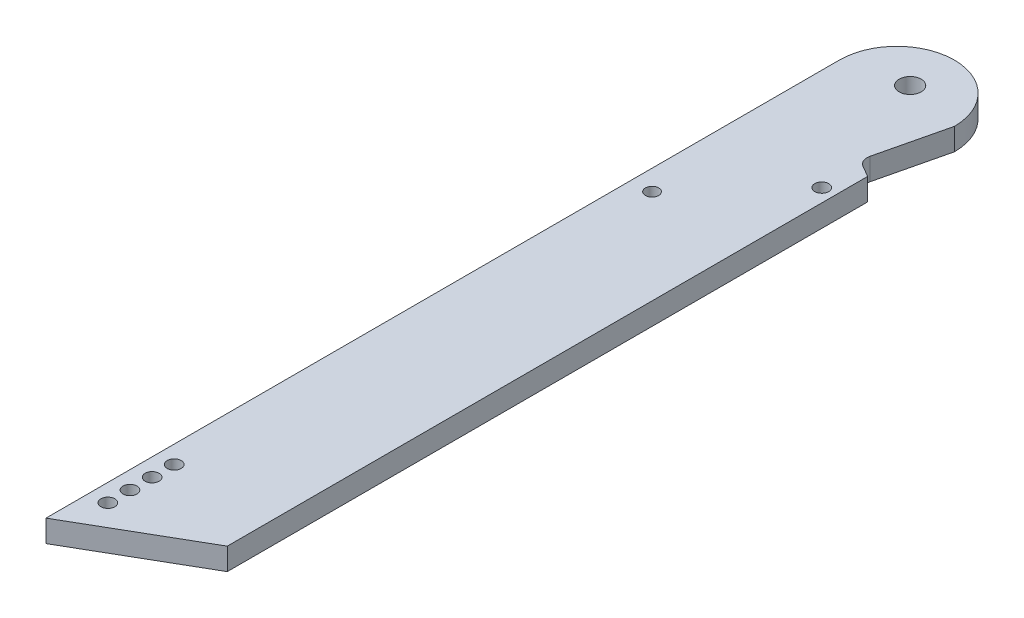
ISO-10303-21;
HEADER;
FILE_DESCRIPTION(('STEP AP214'),'2;1');
FILE_NAME('part.step','',(''),(''),'','','');
FILE_SCHEMA(('AUTOMOTIVE_DESIGN { 1 0 10303 214 1 1 1 1 }'));
ENDSEC;
DATA;
#1=APPLICATION_CONTEXT('core data for automotive mechanical design processes');
#2=APPLICATION_PROTOCOL_DEFINITION('international standard','automotive_design',2000,#1);
#3=PRODUCT_CONTEXT('',#1,'mechanical');
#4=PRODUCT('Part','Part','',(#3));
#5=PRODUCT_RELATED_PRODUCT_CATEGORY('part','',(#4));
#6=PRODUCT_DEFINITION_FORMATION('','',#4);
#7=PRODUCT_DEFINITION_CONTEXT('part definition',#1,'design');
#8=PRODUCT_DEFINITION('design','',#6,#7);
#9=PRODUCT_DEFINITION_SHAPE('','',#8);
#10=(LENGTH_UNIT() NAMED_UNIT(*) SI_UNIT(.MILLI.,.METRE.));
#11=(NAMED_UNIT(*) PLANE_ANGLE_UNIT() SI_UNIT($,.RADIAN.));
#12=(NAMED_UNIT(*) SI_UNIT($,.STERADIAN.) SOLID_ANGLE_UNIT());
#13=UNCERTAINTY_MEASURE_WITH_UNIT(LENGTH_MEASURE(1.E-05),#10,'distance_accuracy_value','');
#14=(GEOMETRIC_REPRESENTATION_CONTEXT(3) GLOBAL_UNCERTAINTY_ASSIGNED_CONTEXT((#13)) GLOBAL_UNIT_ASSIGNED_CONTEXT((#10,
#11,#12)) REPRESENTATION_CONTEXT('',''));
#15=CARTESIAN_POINT('',(0.,0.,0.));
#16=DIRECTION('',(0.,0.,1.));
#17=DIRECTION('',(1.,0.,0.));
#18=AXIS2_PLACEMENT_3D('',#15,#16,#17);
#19=CARTESIAN_POINT('',(-16.51,6.35,3.81));
#20=DIRECTION('',(1.,0.,0.));
#21=DIRECTION('',(0.,0.,-1.));
#22=AXIS2_PLACEMENT_3D('',#19,#20,#21);
#23=PLANE('',#22);
#24=DIRECTION('',(0.,-1.,0.));
#25=VECTOR('',#24,1.);
#26=CARTESIAN_POINT('',(-16.51,6.35,193.675));
#27=LINE('',#26,#25);
#28=CARTESIAN_POINT('',(-16.51,6.35,193.675));
#29=VERTEX_POINT('',#28);
#30=CARTESIAN_POINT('',(-16.51,0.,193.675));
#31=VERTEX_POINT('',#30);
#32=EDGE_CURVE('E12',#29,#31,#27,.T.);
#33=ORIENTED_EDGE('',*,*,#32,.F.);
#34=DIRECTION('',(0.,0.,1.));
#35=VECTOR('',#34,1.);
#36=CARTESIAN_POINT('',(-16.51,6.35,3.81));
#37=LINE('',#36,#35);
#38=CARTESIAN_POINT('',(-16.51,6.35,3.81));
#39=VERTEX_POINT('',#38);
#40=EDGE_CURVE('E102',#39,#29,#37,.T.);
#41=ORIENTED_EDGE('',*,*,#40,.F.);
#42=DIRECTION('',(0.,-1.,0.));
#43=VECTOR('',#42,1.);
#44=CARTESIAN_POINT('',(-16.51,6.35,3.81));
#45=LINE('',#44,#43);
#46=CARTESIAN_POINT('',(-16.51,0.,3.81));
#47=VERTEX_POINT('',#46);
#48=EDGE_CURVE('E50',#39,#47,#45,.T.);
#49=ORIENTED_EDGE('',*,*,#48,.T.);
#50=DIRECTION('',(0.,0.,1.));
#51=VECTOR('',#50,1.);
#52=CARTESIAN_POINT('',(-16.51,0.,3.81));
#53=LINE('',#52,#51);
#54=EDGE_CURVE('E151',#47,#31,#53,.T.);
#55=ORIENTED_EDGE('',*,*,#54,.T.);
#56=EDGE_LOOP('',(#33,#41,#49,#55));
#57=FACE_BOUND('',#56,.T.);
#58=ADVANCED_FACE('F42',(#57),#23,.F.);
#59=CARTESIAN_POINT('',(0.,6.35,3.81));
#60=DIRECTION('',(0.,1.,0.));
#61=DIRECTION('',(0.,0.,1.));
#62=AXIS2_PLACEMENT_3D('',#59,#60,#61);
#63=PLANE('',#62);
#64=CARTESIAN_POINT('',(-10.6553,6.35,63.5));
#65=DIRECTION('',(0.,1.,0.));
#66=DIRECTION('',(0.,0.,1.));
#67=AXIS2_PLACEMENT_3D('',#64,#65,#66);
#68=CIRCLE('',#67,1.905);
#69=CARTESIAN_POINT('',(-10.6553,6.35,65.405));
#70=VERTEX_POINT('',#69);
#71=EDGE_CURVE('E191',#70,#70,#68,.T.);
#72=ORIENTED_EDGE('',*,*,#71,.F.);
#73=EDGE_LOOP('',(#72));
#74=FACE_BOUND('',#73,.T.);
#75=CARTESIAN_POINT('',(-11.43,6.35,219.075));
#76=DIRECTION('',(0.,1.,0.));
#77=DIRECTION('',(0.,0.,1.));
#78=AXIS2_PLACEMENT_3D('',#75,#76,#77);
#79=CIRCLE('',#78,2.);
#80=CARTESIAN_POINT('',(-11.43,6.35,221.075));
#81=VERTEX_POINT('',#80);
#82=EDGE_CURVE('E179',#81,#81,#79,.T.);
#83=ORIENTED_EDGE('',*,*,#82,.F.);
#84=EDGE_LOOP('',(#83));
#85=FACE_BOUND('',#84,.T.);
#86=CARTESIAN_POINT('',(-11.43,6.35,212.725));
#87=DIRECTION('',(0.,1.,0.));
#88=DIRECTION('',(0.,0.,1.));
#89=AXIS2_PLACEMENT_3D('',#86,#87,#88);
#90=CIRCLE('',#89,2.);
#91=CARTESIAN_POINT('',(-11.43,6.35,214.725));
#92=VERTEX_POINT('',#91);
#93=EDGE_CURVE('E167',#92,#92,#90,.T.);
#94=ORIENTED_EDGE('',*,*,#93,.F.);
#95=EDGE_LOOP('',(#94));
#96=FACE_BOUND('',#95,.T.);
#97=CARTESIAN_POINT('',(0.,6.35,3.81));
#98=DIRECTION('',(0.,1.,0.));
#99=DIRECTION('',(0.,0.,1.));
#100=AXIS2_PLACEMENT_3D('',#97,#98,#99);
#101=CIRCLE('',#100,16.51);
#102=CARTESIAN_POINT('',(16.51,6.35,3.81));
#103=VERTEX_POINT('',#102);
#104=EDGE_CURVE('E111',#103,#39,#101,.T.);
#105=ORIENTED_EDGE('',*,*,#104,.T.);
#106=ORIENTED_EDGE('',*,*,#40,.T.);
#107=CARTESIAN_POINT('',(-16.51,6.35,231.775));
#108=VERTEX_POINT('',#107);
#109=EDGE_CURVE('E108',#29,#108,#37,.T.);
#110=ORIENTED_EDGE('',*,*,#109,.T.);
#111=DIRECTION('',(0.866025403784436,0.,-0.500000000000004));
#112=VECTOR('',#111,1.);
#113=CARTESIAN_POINT('',(-16.51,6.35,231.775));
#114=LINE('',#113,#112);
#115=CARTESIAN_POINT('',(16.51,6.35,212.710894111358));
#116=VERTEX_POINT('',#115);
#117=EDGE_CURVE('E107',#108,#116,#114,.T.);
#118=ORIENTED_EDGE('',*,*,#117,.T.);
#119=DIRECTION('',(0.,0.,-1.));
#120=VECTOR('',#119,1.);
#121=CARTESIAN_POINT('',(16.51,6.35,212.710894111358));
#122=LINE('',#121,#120);
#123=CARTESIAN_POINT('',(16.51,6.35,28.7127177616927));
#124=VERTEX_POINT('',#123);
#125=EDGE_CURVE('E161',#116,#124,#122,.T.);
#126=ORIENTED_EDGE('',*,*,#125,.T.);
#127=DIRECTION('',(-0.866025403784436,0.,-0.500000000000004));
#128=VECTOR('',#127,1.);
#129=CARTESIAN_POINT('',(13.335,6.35,26.8796306570156));
#130=LINE('',#129,#128);
#131=CARTESIAN_POINT('',(13.335,6.35,26.8796306570156));
#132=VERTEX_POINT('',#131);
#133=EDGE_CURVE('E159',#124,#132,#130,.T.);
#134=ORIENTED_EDGE('',*,*,#133,.T.);
#135=CARTESIAN_POINT('',(14.9225,6.35,24.13));
#136=DIRECTION('',(0.,-1.,0.));
#137=DIRECTION('',(0.,0.,-1.));
#138=AXIS2_PLACEMENT_3D('',#135,#136,#137);
#139=CIRCLE('',#138,3.175);
#140=CARTESIAN_POINT('',(11.8343084378961,6.35,23.3926412842106));
#141=VERTEX_POINT('',#140);
#142=EDGE_CURVE('E157',#132,#141,#139,.T.);
#143=ORIENTED_EDGE('',*,*,#142,.T.);
#144=DIRECTION('',(0.232238965602949,0.,-0.97265875971775));
#145=VECTOR('',#144,1.);
#146=CARTESIAN_POINT('',(11.8343084378961,6.35,23.3926412842106));
#147=LINE('',#146,#145);
#148=EDGE_CURVE('E115',#141,#103,#147,.T.);
#149=ORIENTED_EDGE('',*,*,#148,.T.);
#150=EDGE_LOOP('',(#105,#106,#110,#118,#126,#134,#143,#149));
#151=FACE_BOUND('',#150,.T.);
#152=CARTESIAN_POINT('',(0.,6.35,0.));
#153=DIRECTION('',(0.,1.,0.));
#154=DIRECTION('',(0.,0.,1.));
#155=AXIS2_PLACEMENT_3D('',#152,#153,#154);
#156=CIRCLE('',#155,3.175);
#157=CARTESIAN_POINT('',(0.,6.35,3.175));
#158=VERTEX_POINT('',#157);
#159=EDGE_CURVE('E155',#158,#158,#156,.T.);
#160=ORIENTED_EDGE('',*,*,#159,.F.);
#161=EDGE_LOOP('',(#160));
#162=FACE_BOUND('',#161,.T.);
#163=CARTESIAN_POINT('',(-11.43,6.35,206.375));
#164=DIRECTION('',(0.,1.,0.));
#165=DIRECTION('',(0.,0.,1.));
#166=AXIS2_PLACEMENT_3D('',#163,#164,#165);
#167=CIRCLE('',#166,2.);
#168=CARTESIAN_POINT('',(-11.43,6.35,208.375));
#169=VERTEX_POINT('',#168);
#170=EDGE_CURVE('E173',#169,#169,#167,.T.);
#171=ORIENTED_EDGE('',*,*,#170,.F.);
#172=EDGE_LOOP('',(#171));
#173=FACE_BOUND('',#172,.T.);
#174=CARTESIAN_POINT('',(-11.43,6.35,200.025));
#175=DIRECTION('',(0.,1.,0.));
#176=DIRECTION('',(0.,0.,1.));
#177=AXIS2_PLACEMENT_3D('',#174,#175,#176);
#178=CIRCLE('',#177,2.);
#179=CARTESIAN_POINT('',(-11.43,6.35,202.025));
#180=VERTEX_POINT('',#179);
#181=EDGE_CURVE('E185',#180,#180,#178,.T.);
#182=ORIENTED_EDGE('',*,*,#181,.F.);
#183=EDGE_LOOP('',(#182));
#184=FACE_BOUND('',#183,.T.);
#185=CARTESIAN_POINT('',(12.7,6.35,38.1));
#186=DIRECTION('',(0.,1.,0.));
#187=DIRECTION('',(0.,0.,1.));
#188=AXIS2_PLACEMENT_3D('',#185,#186,#187);
#189=CIRCLE('',#188,2.);
#190=CARTESIAN_POINT('',(12.7,6.35,40.1));
#191=VERTEX_POINT('',#190);
#192=EDGE_CURVE('E197',#191,#191,#189,.T.);
#193=ORIENTED_EDGE('',*,*,#192,.F.);
#194=EDGE_LOOP('',(#193));
#195=FACE_BOUND('',#194,.T.);
#196=ADVANCED_FACE('F112',(#74,#85,#96,#151,#162,#173,#184,#195),#63,.T.);
#197=CARTESIAN_POINT('',(0.,0.,3.81));
#198=DIRECTION('',(0.,1.,0.));
#199=DIRECTION('',(0.,0.,1.));
#200=AXIS2_PLACEMENT_3D('',#197,#198,#199);
#201=PLANE('',#200);
#202=CARTESIAN_POINT('',(0.,0.,3.81));
#203=DIRECTION('',(0.,1.,0.));
#204=DIRECTION('',(0.,0.,1.));
#205=AXIS2_PLACEMENT_3D('',#202,#203,#204);
#206=CIRCLE('',#205,16.51);
#207=CARTESIAN_POINT('',(16.51,0.,3.81));
#208=VERTEX_POINT('',#207);
#209=EDGE_CURVE('E122',#208,#47,#206,.T.);
#210=ORIENTED_EDGE('',*,*,#209,.F.);
#211=DIRECTION('',(0.232238965602949,0.,-0.97265875971775));
#212=VECTOR('',#211,1.);
#213=CARTESIAN_POINT('',(11.8343084378961,0.,23.3926412842106));
#214=LINE('',#213,#212);
#215=CARTESIAN_POINT('',(11.8343084378961,0.,23.3926412842106));
#216=VERTEX_POINT('',#215);
#217=EDGE_CURVE('E119',#216,#208,#214,.T.);
#218=ORIENTED_EDGE('',*,*,#217,.F.);
#219=CARTESIAN_POINT('',(14.9225,0.,24.13));
#220=DIRECTION('',(0.,-1.,0.));
#221=DIRECTION('',(0.,0.,-1.));
#222=AXIS2_PLACEMENT_3D('',#219,#220,#221);
#223=CIRCLE('',#222,3.175);
#224=CARTESIAN_POINT('',(13.335,0.,26.8796306570156));
#225=VERTEX_POINT('',#224);
#226=EDGE_CURVE('E143',#225,#216,#223,.T.);
#227=ORIENTED_EDGE('',*,*,#226,.F.);
#228=DIRECTION('',(-0.866025403784436,0.,-0.500000000000004));
#229=VECTOR('',#228,1.);
#230=CARTESIAN_POINT('',(13.335,0.,26.8796306570156));
#231=LINE('',#230,#229);
#232=CARTESIAN_POINT('',(16.51,0.,28.7127177616927));
#233=VERTEX_POINT('',#232);
#234=EDGE_CURVE('E145',#233,#225,#231,.T.);
#235=ORIENTED_EDGE('',*,*,#234,.F.);
#236=DIRECTION('',(0.,0.,-1.));
#237=VECTOR('',#236,1.);
#238=CARTESIAN_POINT('',(16.51,0.,212.710894111358));
#239=LINE('',#238,#237);
#240=CARTESIAN_POINT('',(16.51,0.,212.710894111358));
#241=VERTEX_POINT('',#240);
#242=EDGE_CURVE('E147',#241,#233,#239,.T.);
#243=ORIENTED_EDGE('',*,*,#242,.F.);
#244=DIRECTION('',(0.866025403784436,0.,-0.500000000000004));
#245=VECTOR('',#244,1.);
#246=CARTESIAN_POINT('',(-16.51,0.,231.775));
#247=LINE('',#246,#245);
#248=CARTESIAN_POINT('',(-16.51,0.,231.775));
#249=VERTEX_POINT('',#248);
#250=EDGE_CURVE('E149',#249,#241,#247,.T.);
#251=ORIENTED_EDGE('',*,*,#250,.F.);
#252=EDGE_CURVE('E153',#31,#249,#53,.T.);
#253=ORIENTED_EDGE('',*,*,#252,.F.);
#254=ORIENTED_EDGE('',*,*,#54,.F.);
#255=EDGE_LOOP('',(#210,#218,#227,#235,#243,#251,#253,#254));
#256=FACE_BOUND('',#255,.T.);
#257=CARTESIAN_POINT('',(0.,0.,0.));
#258=DIRECTION('',(0.,1.,0.));
#259=DIRECTION('',(0.,0.,1.));
#260=AXIS2_PLACEMENT_3D('',#257,#258,#259);
#261=CIRCLE('',#260,3.175);
#262=CARTESIAN_POINT('',(0.,0.,3.175));
#263=VERTEX_POINT('',#262);
#264=EDGE_CURVE('E164',#263,#263,#261,.T.);
#265=ORIENTED_EDGE('',*,*,#264,.T.);
#266=EDGE_LOOP('',(#265));
#267=FACE_BOUND('',#266,.T.);
#268=CARTESIAN_POINT('',(-11.43,0.,212.725));
#269=DIRECTION('',(0.,1.,0.));
#270=DIRECTION('',(0.,0.,1.));
#271=AXIS2_PLACEMENT_3D('',#268,#269,#270);
#272=CIRCLE('',#271,2.);
#273=CARTESIAN_POINT('',(-11.43,0.,214.725));
#274=VERTEX_POINT('',#273);
#275=EDGE_CURVE('E170',#274,#274,#272,.T.);
#276=ORIENTED_EDGE('',*,*,#275,.T.);
#277=EDGE_LOOP('',(#276));
#278=FACE_BOUND('',#277,.T.);
#279=CARTESIAN_POINT('',(-11.43,0.,206.375));
#280=DIRECTION('',(0.,1.,0.));
#281=DIRECTION('',(0.,0.,1.));
#282=AXIS2_PLACEMENT_3D('',#279,#280,#281);
#283=CIRCLE('',#282,2.);
#284=CARTESIAN_POINT('',(-11.43,0.,208.375));
#285=VERTEX_POINT('',#284);
#286=EDGE_CURVE('E176',#285,#285,#283,.T.);
#287=ORIENTED_EDGE('',*,*,#286,.T.);
#288=EDGE_LOOP('',(#287));
#289=FACE_BOUND('',#288,.T.);
#290=CARTESIAN_POINT('',(-11.43,0.,219.075));
#291=DIRECTION('',(0.,1.,0.));
#292=DIRECTION('',(0.,0.,1.));
#293=AXIS2_PLACEMENT_3D('',#290,#291,#292);
#294=CIRCLE('',#293,2.);
#295=CARTESIAN_POINT('',(-11.43,0.,221.075));
#296=VERTEX_POINT('',#295);
#297=EDGE_CURVE('E182',#296,#296,#294,.T.);
#298=ORIENTED_EDGE('',*,*,#297,.T.);
#299=EDGE_LOOP('',(#298));
#300=FACE_BOUND('',#299,.T.);
#301=CARTESIAN_POINT('',(-11.43,0.,200.025));
#302=DIRECTION('',(0.,1.,0.));
#303=DIRECTION('',(0.,0.,1.));
#304=AXIS2_PLACEMENT_3D('',#301,#302,#303);
#305=CIRCLE('',#304,2.);
#306=CARTESIAN_POINT('',(-11.43,0.,202.025));
#307=VERTEX_POINT('',#306);
#308=EDGE_CURVE('E188',#307,#307,#305,.T.);
#309=ORIENTED_EDGE('',*,*,#308,.T.);
#310=EDGE_LOOP('',(#309));
#311=FACE_BOUND('',#310,.T.);
#312=CARTESIAN_POINT('',(-10.6553,0.,63.5));
#313=DIRECTION('',(0.,1.,0.));
#314=DIRECTION('',(0.,0.,1.));
#315=AXIS2_PLACEMENT_3D('',#312,#313,#314);
#316=CIRCLE('',#315,1.905);
#317=CARTESIAN_POINT('',(-10.6553,0.,65.405));
#318=VERTEX_POINT('',#317);
#319=EDGE_CURVE('E194',#318,#318,#316,.T.);
#320=ORIENTED_EDGE('',*,*,#319,.T.);
#321=EDGE_LOOP('',(#320));
#322=FACE_BOUND('',#321,.T.);
#323=CARTESIAN_POINT('',(12.7,0.,38.1));
#324=DIRECTION('',(0.,1.,0.));
#325=DIRECTION('',(0.,0.,1.));
#326=AXIS2_PLACEMENT_3D('',#323,#324,#325);
#327=CIRCLE('',#326,2.);
#328=CARTESIAN_POINT('',(12.7,0.,40.1));
#329=VERTEX_POINT('',#328);
#330=EDGE_CURVE('E200',#329,#329,#327,.T.);
#331=ORIENTED_EDGE('',*,*,#330,.T.);
#332=EDGE_LOOP('',(#331));
#333=FACE_BOUND('',#332,.T.);
#334=ADVANCED_FACE('F210',(#256,#267,#278,#289,#300,#311,#322,#333),#201,.F.);
#335=CARTESIAN_POINT('',(0.,6.35,3.81));
#336=DIRECTION('',(0.,-1.,0.));
#337=DIRECTION('',(0.,0.,-1.));
#338=AXIS2_PLACEMENT_3D('',#335,#336,#337);
#339=CYLINDRICAL_SURFACE('',#338,16.51);
#340=ORIENTED_EDGE('',*,*,#209,.T.);
#341=ORIENTED_EDGE('',*,*,#48,.F.);
#342=ORIENTED_EDGE('',*,*,#104,.F.);
#343=DIRECTION('',(0.,-1.,0.));
#344=VECTOR('',#343,1.);
#345=CARTESIAN_POINT('',(16.51,6.35,3.81));
#346=LINE('',#345,#344);
#347=EDGE_CURVE('E140',#103,#208,#346,.T.);
#348=ORIENTED_EDGE('',*,*,#347,.T.);
#349=EDGE_LOOP('',(#340,#341,#342,#348));
#350=FACE_BOUND('',#349,.T.);
#351=ADVANCED_FACE('F44',(#350),#339,.T.);
#352=ORIENTED_EDGE('',*,*,#109,.F.);
#353=ORIENTED_EDGE('',*,*,#32,.T.);
#354=ORIENTED_EDGE('',*,*,#252,.T.);
#355=DIRECTION('',(0.,-1.,0.));
#356=VECTOR('',#355,1.);
#357=CARTESIAN_POINT('',(-16.51,6.35,231.775));
#358=LINE('',#357,#356);
#359=EDGE_CURVE('E123',#108,#249,#358,.T.);
#360=ORIENTED_EDGE('',*,*,#359,.F.);
#361=EDGE_LOOP('',(#352,#353,#354,#360));
#362=FACE_BOUND('',#361,.T.);
#363=ADVANCED_FACE('F219',(#362),#23,.F.);
#364=CARTESIAN_POINT('',(-16.51,6.35,231.775));
#365=DIRECTION('',(-0.500000000000004,0.,-0.866025403784436));
#366=DIRECTION('',(-0.866025403784436,0.,0.500000000000004));
#367=AXIS2_PLACEMENT_3D('',#364,#365,#366);
#368=PLANE('',#367);
#369=ORIENTED_EDGE('',*,*,#250,.T.);
#370=DIRECTION('',(0.,-1.,0.));
#371=VECTOR('',#370,1.);
#372=CARTESIAN_POINT('',(16.51,6.35,212.710894111358));
#373=LINE('',#372,#371);
#374=EDGE_CURVE('E125',#116,#241,#373,.T.);
#375=ORIENTED_EDGE('',*,*,#374,.F.);
#376=ORIENTED_EDGE('',*,*,#117,.F.);
#377=ORIENTED_EDGE('',*,*,#359,.T.);
#378=EDGE_LOOP('',(#369,#375,#376,#377));
#379=FACE_BOUND('',#378,.T.);
#380=ADVANCED_FACE('F241',(#379),#368,.F.);
#381=CARTESIAN_POINT('',(16.51,6.35,212.710894111358));
#382=DIRECTION('',(-1.,0.,0.));
#383=DIRECTION('',(0.,0.,1.));
#384=AXIS2_PLACEMENT_3D('',#381,#382,#383);
#385=PLANE('',#384);
#386=ORIENTED_EDGE('',*,*,#242,.T.);
#387=DIRECTION('',(0.,-1.,0.));
#388=VECTOR('',#387,1.);
#389=CARTESIAN_POINT('',(16.51,6.35,28.7127177616927));
#390=LINE('',#389,#388);
#391=EDGE_CURVE('E131',#124,#233,#390,.T.);
#392=ORIENTED_EDGE('',*,*,#391,.F.);
#393=ORIENTED_EDGE('',*,*,#125,.F.);
#394=ORIENTED_EDGE('',*,*,#374,.T.);
#395=EDGE_LOOP('',(#386,#392,#393,#394));
#396=FACE_BOUND('',#395,.T.);
#397=ADVANCED_FACE('F237',(#396),#385,.F.);
#398=CARTESIAN_POINT('',(13.335,6.35,26.8796306570156));
#399=DIRECTION('',(-0.500000000000004,0.,0.866025403784436));
#400=DIRECTION('',(0.866025403784437,0.,0.500000000000004));
#401=AXIS2_PLACEMENT_3D('',#398,#399,#400);
#402=PLANE('',#401);
#403=ORIENTED_EDGE('',*,*,#234,.T.);
#404=DIRECTION('',(0.,-1.,0.));
#405=VECTOR('',#404,1.);
#406=CARTESIAN_POINT('',(13.335,6.35,26.8796306570156));
#407=LINE('',#406,#405);
#408=EDGE_CURVE('E134',#132,#225,#407,.T.);
#409=ORIENTED_EDGE('',*,*,#408,.F.);
#410=ORIENTED_EDGE('',*,*,#133,.F.);
#411=ORIENTED_EDGE('',*,*,#391,.T.);
#412=EDGE_LOOP('',(#403,#409,#410,#411));
#413=FACE_BOUND('',#412,.T.);
#414=ADVANCED_FACE('F233',(#413),#402,.F.);
#415=CARTESIAN_POINT('',(14.9225,6.35,24.13));
#416=DIRECTION('',(0.,-1.,0.));
#417=DIRECTION('',(0.,0.,-1.));
#418=AXIS2_PLACEMENT_3D('',#415,#416,#417);
#419=CYLINDRICAL_SURFACE('',#418,3.175);
#420=ORIENTED_EDGE('',*,*,#226,.T.);
#421=DIRECTION('',(0.,-1.,0.));
#422=VECTOR('',#421,1.);
#423=CARTESIAN_POINT('',(11.8343084378961,6.35,23.3926412842106));
#424=LINE('',#423,#422);
#425=EDGE_CURVE('E137',#141,#216,#424,.T.);
#426=ORIENTED_EDGE('',*,*,#425,.F.);
#427=ORIENTED_EDGE('',*,*,#142,.F.);
#428=ORIENTED_EDGE('',*,*,#408,.T.);
#429=EDGE_LOOP('',(#420,#426,#427,#428));
#430=FACE_BOUND('',#429,.T.);
#431=ADVANCED_FACE('F229',(#430),#419,.F.);
#432=CARTESIAN_POINT('',(11.8343084378961,6.35,23.3926412842106));
#433=DIRECTION('',(-0.97265875971775,0.,-0.232238965602949));
#434=DIRECTION('',(-0.232238965602949,0.,0.97265875971775));
#435=AXIS2_PLACEMENT_3D('',#432,#433,#434);
#436=PLANE('',#435);
#437=ORIENTED_EDGE('',*,*,#217,.T.);
#438=ORIENTED_EDGE('',*,*,#347,.F.);
#439=ORIENTED_EDGE('',*,*,#148,.F.);
#440=ORIENTED_EDGE('',*,*,#425,.T.);
#441=EDGE_LOOP('',(#437,#438,#439,#440));
#442=FACE_BOUND('',#441,.T.);
#443=ADVANCED_FACE('F226',(#442),#436,.F.);
#444=CARTESIAN_POINT('',(0.,6.35,0.));
#445=DIRECTION('',(0.,-1.,0.));
#446=DIRECTION('',(0.,0.,-1.));
#447=AXIS2_PLACEMENT_3D('',#444,#445,#446);
#448=CYLINDRICAL_SURFACE('',#447,3.175);
#449=ORIENTED_EDGE('',*,*,#159,.T.);
#450=EDGE_LOOP('',(#449));
#451=FACE_BOUND('',#450,.T.);
#452=ORIENTED_EDGE('',*,*,#264,.F.);
#453=EDGE_LOOP('',(#452));
#454=FACE_BOUND('',#453,.T.);
#455=ADVANCED_FACE('F223',(#451,#454),#448,.F.);
#456=CARTESIAN_POINT('',(-11.43,6.35,212.725));
#457=DIRECTION('',(0.,-1.,0.));
#458=DIRECTION('',(0.,0.,-1.));
#459=AXIS2_PLACEMENT_3D('',#456,#457,#458);
#460=CYLINDRICAL_SURFACE('',#459,2.);
#461=ORIENTED_EDGE('',*,*,#93,.T.);
#462=EDGE_LOOP('',(#461));
#463=FACE_BOUND('',#462,.T.);
#464=ORIENTED_EDGE('',*,*,#275,.F.);
#465=EDGE_LOOP('',(#464));
#466=FACE_BOUND('',#465,.T.);
#467=ADVANCED_FACE('F296',(#463,#466),#460,.F.);
#468=CARTESIAN_POINT('',(-11.43,6.35,206.375));
#469=DIRECTION('',(0.,-1.,0.));
#470=DIRECTION('',(0.,0.,-1.));
#471=AXIS2_PLACEMENT_3D('',#468,#469,#470);
#472=CYLINDRICAL_SURFACE('',#471,2.);
#473=ORIENTED_EDGE('',*,*,#170,.T.);
#474=EDGE_LOOP('',(#473));
#475=FACE_BOUND('',#474,.T.);
#476=ORIENTED_EDGE('',*,*,#286,.F.);
#477=EDGE_LOOP('',(#476));
#478=FACE_BOUND('',#477,.T.);
#479=ADVANCED_FACE('F293',(#475,#478),#472,.F.);
#480=CARTESIAN_POINT('',(-11.43,6.35,219.075));
#481=DIRECTION('',(0.,-1.,0.));
#482=DIRECTION('',(0.,0.,-1.));
#483=AXIS2_PLACEMENT_3D('',#480,#481,#482);
#484=CYLINDRICAL_SURFACE('',#483,2.);
#485=ORIENTED_EDGE('',*,*,#82,.T.);
#486=EDGE_LOOP('',(#485));
#487=FACE_BOUND('',#486,.T.);
#488=ORIENTED_EDGE('',*,*,#297,.F.);
#489=EDGE_LOOP('',(#488));
#490=FACE_BOUND('',#489,.T.);
#491=ADVANCED_FACE('F289',(#487,#490),#484,.F.);
#492=CARTESIAN_POINT('',(-11.43,6.35,200.025));
#493=DIRECTION('',(0.,-1.,0.));
#494=DIRECTION('',(0.,0.,-1.));
#495=AXIS2_PLACEMENT_3D('',#492,#493,#494);
#496=CYLINDRICAL_SURFACE('',#495,2.);
#497=ORIENTED_EDGE('',*,*,#181,.T.);
#498=EDGE_LOOP('',(#497));
#499=FACE_BOUND('',#498,.T.);
#500=ORIENTED_EDGE('',*,*,#308,.F.);
#501=EDGE_LOOP('',(#500));
#502=FACE_BOUND('',#501,.T.);
#503=ADVANCED_FACE('F283',(#499,#502),#496,.F.);
#504=CARTESIAN_POINT('',(-10.6553,6.35,63.5));
#505=DIRECTION('',(0.,-1.,0.));
#506=DIRECTION('',(0.,0.,-1.));
#507=AXIS2_PLACEMENT_3D('',#504,#505,#506);
#508=CYLINDRICAL_SURFACE('',#507,1.905);
#509=ORIENTED_EDGE('',*,*,#71,.T.);
#510=EDGE_LOOP('',(#509));
#511=FACE_BOUND('',#510,.T.);
#512=ORIENTED_EDGE('',*,*,#319,.F.);
#513=EDGE_LOOP('',(#512));
#514=FACE_BOUND('',#513,.T.);
#515=ADVANCED_FACE('F278',(#511,#514),#508,.F.);
#516=CARTESIAN_POINT('',(12.7,6.35,38.1));
#517=DIRECTION('',(0.,-1.,0.));
#518=DIRECTION('',(0.,0.,-1.));
#519=AXIS2_PLACEMENT_3D('',#516,#517,#518);
#520=CYLINDRICAL_SURFACE('',#519,2.);
#521=ORIENTED_EDGE('',*,*,#192,.T.);
#522=EDGE_LOOP('',(#521));
#523=FACE_BOUND('',#522,.T.);
#524=ORIENTED_EDGE('',*,*,#330,.F.);
#525=EDGE_LOOP('',(#524));
#526=FACE_BOUND('',#525,.T.);
#527=ADVANCED_FACE('F206',(#523,#526),#520,.F.);
#528=CLOSED_SHELL('',(#58,#196,#334,#351,#363,#380,#397,#414,#431,#443,#455,#467,#479,#491,#503,
#515,#527));
#529=MANIFOLD_SOLID_BREP('B2',#528);
#530=ADVANCED_BREP_SHAPE_REPRESENTATION('',(#18,#529),#14);
#531=SHAPE_DEFINITION_REPRESENTATION(#9,#530);
ENDSEC;
END-ISO-10303-21;
